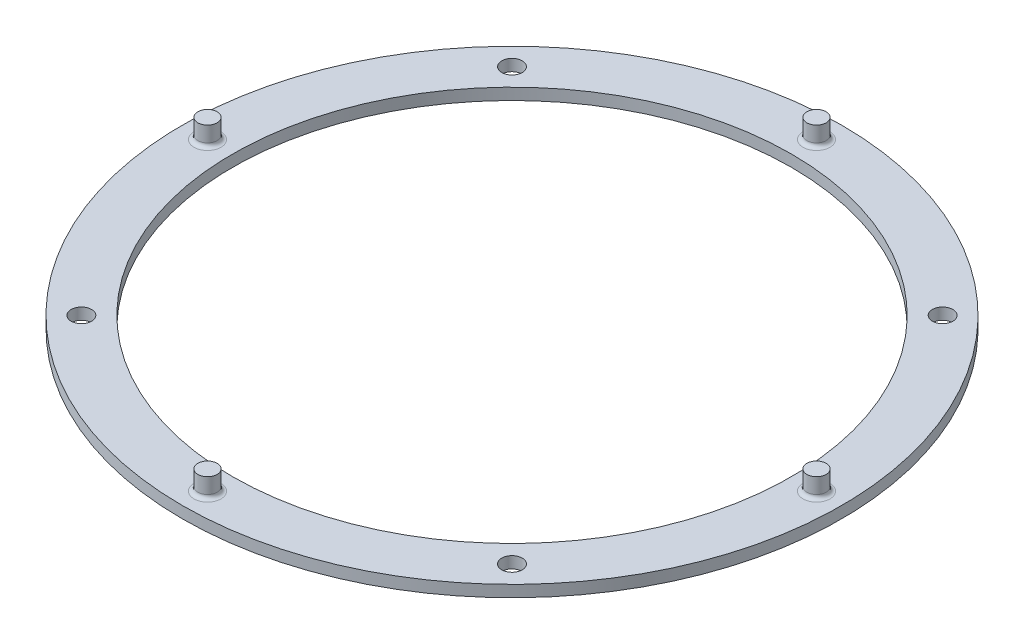
ISO-10303-21;
HEADER;
FILE_DESCRIPTION(('STEP AP214'),'2;1');
FILE_NAME('part.step','',(''),(''),'','','');
FILE_SCHEMA(('AUTOMOTIVE_DESIGN { 1 0 10303 214 1 1 1 1 }'));
ENDSEC;
DATA;
#1=APPLICATION_CONTEXT('core data for automotive mechanical design processes');
#2=APPLICATION_PROTOCOL_DEFINITION('international standard','automotive_design',2000,#1);
#3=PRODUCT_CONTEXT('',#1,'mechanical');
#4=PRODUCT('Part','Part','',(#3));
#5=PRODUCT_RELATED_PRODUCT_CATEGORY('part','',(#4));
#6=PRODUCT_DEFINITION_FORMATION('','',#4);
#7=PRODUCT_DEFINITION_CONTEXT('part definition',#1,'design');
#8=PRODUCT_DEFINITION('design','',#6,#7);
#9=PRODUCT_DEFINITION_SHAPE('','',#8);
#10=(LENGTH_UNIT() NAMED_UNIT(*) SI_UNIT(.MILLI.,.METRE.));
#11=(NAMED_UNIT(*) PLANE_ANGLE_UNIT() SI_UNIT($,.RADIAN.));
#12=(NAMED_UNIT(*) SI_UNIT($,.STERADIAN.) SOLID_ANGLE_UNIT());
#13=UNCERTAINTY_MEASURE_WITH_UNIT(LENGTH_MEASURE(1.E-05),#10,'distance_accuracy_value','');
#14=(GEOMETRIC_REPRESENTATION_CONTEXT(3) GLOBAL_UNCERTAINTY_ASSIGNED_CONTEXT((#13)) GLOBAL_UNIT_ASSIGNED_CONTEXT((#10,
#11,#12)) REPRESENTATION_CONTEXT('',''));
#15=CARTESIAN_POINT('',(0.,0.,0.));
#16=DIRECTION('',(0.,0.,1.));
#17=DIRECTION('',(1.,0.,0.));
#18=AXIS2_PLACEMENT_3D('',#15,#16,#17);
#19=CARTESIAN_POINT('',(0.,3.,0.));
#20=DIRECTION('',(0.,1.,0.));
#21=DIRECTION('',(0.,0.,1.));
#22=AXIS2_PLACEMENT_3D('',#19,#20,#21);
#23=PLANE('',#22);
#24=CARTESIAN_POINT('',(55.8614357137374,3.,-55.8614357137372));
#25=DIRECTION('',(0.,1.,0.));
#26=DIRECTION('',(0.,0.,1.));
#27=AXIS2_PLACEMENT_3D('',#24,#25,#26);
#28=CIRCLE('',#27,2.65);
#29=CARTESIAN_POINT('',(55.8614357137374,3.,-53.2114357137372));
#30=VERTEX_POINT('',#29);
#31=EDGE_CURVE('E249',#30,#30,#28,.T.);
#32=ORIENTED_EDGE('',*,*,#31,.F.);
#33=EDGE_LOOP('',(#32));
#34=FACE_BOUND('',#33,.T.);
#35=CARTESIAN_POINT('',(55.861435713737,3.,55.8614357137375));
#36=DIRECTION('',(0.,1.,0.));
#37=DIRECTION('',(0.,0.,1.));
#38=AXIS2_PLACEMENT_3D('',#35,#36,#37);
#39=CIRCLE('',#38,2.65);
#40=CARTESIAN_POINT('',(55.861435713737,3.,58.5114357137375));
#41=VERTEX_POINT('',#40);
#42=EDGE_CURVE('E242',#41,#41,#39,.T.);
#43=ORIENTED_EDGE('',*,*,#42,.F.);
#44=EDGE_LOOP('',(#43));
#45=FACE_BOUND('',#44,.T.);
#46=CARTESIAN_POINT('',(-55.8614357137377,3.,55.8614357137368));
#47=DIRECTION('',(0.,1.,0.));
#48=DIRECTION('',(0.,0.,1.));
#49=AXIS2_PLACEMENT_3D('',#46,#47,#48);
#50=CIRCLE('',#49,2.64999999999999);
#51=CARTESIAN_POINT('',(-55.8614357137377,3.,58.5114357137368));
#52=VERTEX_POINT('',#51);
#53=EDGE_CURVE('E234',#52,#52,#50,.T.);
#54=ORIENTED_EDGE('',*,*,#53,.F.);
#55=EDGE_LOOP('',(#54));
#56=FACE_BOUND('',#55,.T.);
#57=CARTESIAN_POINT('',(-55.8614357137366,3.,-55.8614357137379));
#58=DIRECTION('',(0.,1.,0.));
#59=DIRECTION('',(0.,0.,1.));
#60=AXIS2_PLACEMENT_3D('',#57,#58,#59);
#61=CIRCLE('',#60,2.65);
#62=CARTESIAN_POINT('',(-55.8614357137366,3.,-53.2114357137379));
#63=VERTEX_POINT('',#62);
#64=EDGE_CURVE('E67',#63,#63,#61,.T.);
#65=ORIENTED_EDGE('',*,*,#64,.F.);
#66=EDGE_LOOP('',(#65));
#67=FACE_BOUND('',#66,.T.);
#68=CARTESIAN_POINT('',(79.,3.,2.75827025768608E-13));
#69=DIRECTION('',(0.,1.,0.));
#70=DIRECTION('',(0.,0.,1.));
#71=AXIS2_PLACEMENT_3D('',#68,#69,#70);
#72=CIRCLE('',#71,3.50000000000001);
#73=CARTESIAN_POINT('',(79.,3.,3.50000000000028));
#74=VERTEX_POINT('',#73);
#75=EDGE_CURVE('E125',#74,#74,#72,.F.);
#76=ORIENTED_EDGE('',*,*,#75,.T.);
#77=EDGE_LOOP('',(#76));
#78=FACE_BOUND('',#77,.T.);
#79=CARTESIAN_POINT('',(0.,3.,-79.));
#80=DIRECTION('',(0.,1.,0.));
#81=DIRECTION('',(0.,0.,1.));
#82=AXIS2_PLACEMENT_3D('',#79,#80,#81);
#83=CIRCLE('',#82,3.5);
#84=CARTESIAN_POINT('',(0.,3.,-75.5));
#85=VERTEX_POINT('',#84);
#86=EDGE_CURVE('E121',#85,#85,#83,.F.);
#87=ORIENTED_EDGE('',*,*,#86,.T.);
#88=EDGE_LOOP('',(#87));
#89=FACE_BOUND('',#88,.T.);
#90=CARTESIAN_POINT('',(-79.,3.,-8.27481077305823E-13));
#91=DIRECTION('',(0.,1.,0.));
#92=DIRECTION('',(0.,0.,1.));
#93=AXIS2_PLACEMENT_3D('',#90,#91,#92);
#94=CIRCLE('',#93,3.5);
#95=CARTESIAN_POINT('',(-79.,3.,3.49999999999917));
#96=VERTEX_POINT('',#95);
#97=EDGE_CURVE('E117',#96,#96,#94,.F.);
#98=ORIENTED_EDGE('',*,*,#97,.T.);
#99=EDGE_LOOP('',(#98));
#100=FACE_BOUND('',#99,.T.);
#101=CARTESIAN_POINT('',(-5.51654051537215E-13,3.,79.));
#102=DIRECTION('',(0.,1.,0.));
#103=DIRECTION('',(0.,0.,1.));
#104=AXIS2_PLACEMENT_3D('',#101,#102,#103);
#105=CIRCLE('',#104,3.5);
#106=CARTESIAN_POINT('',(-5.51654051537215E-13,3.,82.5));
#107=VERTEX_POINT('',#106);
#108=EDGE_CURVE('E113',#107,#107,#105,.F.);
#109=ORIENTED_EDGE('',*,*,#108,.T.);
#110=EDGE_LOOP('',(#109));
#111=FACE_BOUND('',#110,.T.);
#112=CARTESIAN_POINT('',(0.,3.,0.));
#113=DIRECTION('',(0.,1.,0.));
#114=DIRECTION('',(0.,0.,1.));
#115=AXIS2_PLACEMENT_3D('',#112,#113,#114);
#116=CIRCLE('',#115,85.5);
#117=CARTESIAN_POINT('',(0.,3.,85.5));
#118=VERTEX_POINT('',#117);
#119=EDGE_CURVE('E102',#118,#118,#116,.T.);
#120=ORIENTED_EDGE('',*,*,#119,.T.);
#121=EDGE_LOOP('',(#120));
#122=FACE_BOUND('',#121,.T.);
#123=CARTESIAN_POINT('',(0.,3.,0.));
#124=DIRECTION('',(0.,1.,0.));
#125=DIRECTION('',(0.,0.,1.));
#126=AXIS2_PLACEMENT_3D('',#123,#124,#125);
#127=CIRCLE('',#126,72.5);
#128=CARTESIAN_POINT('',(0.,3.,72.5));
#129=VERTEX_POINT('',#128);
#130=EDGE_CURVE('E92',#129,#129,#127,.T.);
#131=ORIENTED_EDGE('',*,*,#130,.F.);
#132=EDGE_LOOP('',(#131));
#133=FACE_BOUND('',#132,.T.);
#134=ADVANCED_FACE('F43',(#34,#45,#56,#67,#78,#89,#100,#111,#122,#133),#23,.T.);
#135=CARTESIAN_POINT('',(0.,0.,0.));
#136=DIRECTION('',(0.,1.,0.));
#137=DIRECTION('',(0.,0.,1.));
#138=AXIS2_PLACEMENT_3D('',#135,#136,#137);
#139=PLANE('',#138);
#140=CARTESIAN_POINT('',(55.8614357137374,0.,-55.8614357137372));
#141=DIRECTION('',(0.,1.,0.));
#142=DIRECTION('',(0.,0.,1.));
#143=AXIS2_PLACEMENT_3D('',#140,#141,#142);
#144=CIRCLE('',#143,2.65);
#145=CARTESIAN_POINT('',(55.8614357137374,0.,-53.2114357137372));
#146=VERTEX_POINT('',#145);
#147=EDGE_CURVE('E47',#146,#146,#144,.T.);
#148=ORIENTED_EDGE('',*,*,#147,.T.);
#149=EDGE_LOOP('',(#148));
#150=FACE_BOUND('',#149,.T.);
#151=CARTESIAN_POINT('',(55.861435713737,0.,55.8614357137375));
#152=DIRECTION('',(0.,1.,0.));
#153=DIRECTION('',(0.,0.,1.));
#154=AXIS2_PLACEMENT_3D('',#151,#152,#153);
#155=CIRCLE('',#154,2.65);
#156=CARTESIAN_POINT('',(55.861435713737,0.,58.5114357137375));
#157=VERTEX_POINT('',#156);
#158=EDGE_CURVE('E70',#157,#157,#155,.T.);
#159=ORIENTED_EDGE('',*,*,#158,.T.);
#160=EDGE_LOOP('',(#159));
#161=FACE_BOUND('',#160,.T.);
#162=CARTESIAN_POINT('',(-55.8614357137377,0.,55.8614357137368));
#163=DIRECTION('',(0.,1.,0.));
#164=DIRECTION('',(0.,0.,1.));
#165=AXIS2_PLACEMENT_3D('',#162,#163,#164);
#166=CIRCLE('',#165,2.64999999999999);
#167=CARTESIAN_POINT('',(-55.8614357137377,0.,58.5114357137368));
#168=VERTEX_POINT('',#167);
#169=EDGE_CURVE('E66',#168,#168,#166,.T.);
#170=ORIENTED_EDGE('',*,*,#169,.T.);
#171=EDGE_LOOP('',(#170));
#172=FACE_BOUND('',#171,.T.);
#173=CARTESIAN_POINT('',(-55.8614357137366,0.,-55.8614357137379));
#174=DIRECTION('',(0.,1.,0.));
#175=DIRECTION('',(0.,0.,1.));
#176=AXIS2_PLACEMENT_3D('',#173,#174,#175);
#177=CIRCLE('',#176,2.65);
#178=CARTESIAN_POINT('',(-55.8614357137366,0.,-53.2114357137379));
#179=VERTEX_POINT('',#178);
#180=EDGE_CURVE('E62',#179,#179,#177,.T.);
#181=ORIENTED_EDGE('',*,*,#180,.T.);
#182=EDGE_LOOP('',(#181));
#183=FACE_BOUND('',#182,.T.);
#184=CARTESIAN_POINT('',(0.,0.,0.));
#185=DIRECTION('',(0.,1.,0.));
#186=DIRECTION('',(0.,0.,1.));
#187=AXIS2_PLACEMENT_3D('',#184,#185,#186);
#188=CIRCLE('',#187,85.5);
#189=CARTESIAN_POINT('',(0.,0.,85.5));
#190=VERTEX_POINT('',#189);
#191=EDGE_CURVE('E96',#190,#190,#188,.T.);
#192=ORIENTED_EDGE('',*,*,#191,.F.);
#193=EDGE_LOOP('',(#192));
#194=FACE_BOUND('',#193,.T.);
#195=CARTESIAN_POINT('',(0.,0.,0.));
#196=DIRECTION('',(0.,1.,0.));
#197=DIRECTION('',(0.,0.,1.));
#198=AXIS2_PLACEMENT_3D('',#195,#196,#197);
#199=CIRCLE('',#198,72.5);
#200=CARTESIAN_POINT('',(0.,0.,72.5));
#201=VERTEX_POINT('',#200);
#202=EDGE_CURVE('E97',#201,#201,#199,.T.);
#203=ORIENTED_EDGE('',*,*,#202,.T.);
#204=EDGE_LOOP('',(#203));
#205=FACE_BOUND('',#204,.T.);
#206=ADVANCED_FACE('F151',(#150,#161,#172,#183,#194,#205),#139,.F.);
#207=CARTESIAN_POINT('',(0.,3.,0.));
#208=DIRECTION('',(0.,-1.,0.));
#209=DIRECTION('',(0.,0.,-1.));
#210=AXIS2_PLACEMENT_3D('',#207,#208,#209);
#211=CYLINDRICAL_SURFACE('',#210,85.5);
#212=ORIENTED_EDGE('',*,*,#119,.F.);
#213=EDGE_LOOP('',(#212));
#214=FACE_BOUND('',#213,.T.);
#215=ORIENTED_EDGE('',*,*,#191,.T.);
#216=EDGE_LOOP('',(#215));
#217=FACE_BOUND('',#216,.T.);
#218=ADVANCED_FACE('F158',(#214,#217),#211,.T.);
#219=CARTESIAN_POINT('',(0.,3.,0.));
#220=DIRECTION('',(0.,-1.,0.));
#221=DIRECTION('',(0.,0.,-1.));
#222=AXIS2_PLACEMENT_3D('',#219,#220,#221);
#223=CYLINDRICAL_SURFACE('',#222,72.5);
#224=ORIENTED_EDGE('',*,*,#130,.T.);
#225=EDGE_LOOP('',(#224));
#226=FACE_BOUND('',#225,.T.);
#227=ORIENTED_EDGE('',*,*,#202,.F.);
#228=EDGE_LOOP('',(#227));
#229=FACE_BOUND('',#228,.T.);
#230=ADVANCED_FACE('F163',(#226,#229),#223,.F.);
#231=CARTESIAN_POINT('',(-5.51654051537215E-13,8.,79.));
#232=DIRECTION('',(0.,-1.,0.));
#233=DIRECTION('',(0.,0.,-1.));
#234=AXIS2_PLACEMENT_3D('',#231,#232,#233);
#235=CYLINDRICAL_SURFACE('',#234,2.5);
#236=CARTESIAN_POINT('',(-5.51654051537215E-13,4.,79.));
#237=DIRECTION('',(0.,1.,0.));
#238=DIRECTION('',(0.,0.,1.));
#239=AXIS2_PLACEMENT_3D('',#236,#237,#238);
#240=CIRCLE('',#239,2.5);
#241=CARTESIAN_POINT('',(-5.51654051537215E-13,4.,81.5));
#242=VERTEX_POINT('',#241);
#243=EDGE_CURVE('E10',#242,#242,#240,.T.);
#244=ORIENTED_EDGE('',*,*,#243,.T.);
#245=EDGE_LOOP('',(#244));
#246=FACE_BOUND('',#245,.T.);
#247=CARTESIAN_POINT('',(-5.51654051537215E-13,8.,79.));
#248=DIRECTION('',(0.,1.,0.));
#249=DIRECTION('',(0.,0.,1.));
#250=AXIS2_PLACEMENT_3D('',#247,#248,#249);
#251=CIRCLE('',#250,2.5);
#252=CARTESIAN_POINT('',(-5.51654051537215E-13,8.,81.5));
#253=VERTEX_POINT('',#252);
#254=EDGE_CURVE('E77',#253,#253,#251,.T.);
#255=ORIENTED_EDGE('',*,*,#254,.F.);
#256=EDGE_LOOP('',(#255));
#257=FACE_BOUND('',#256,.T.);
#258=ADVANCED_FACE('F171',(#246,#257),#235,.T.);
#259=CARTESIAN_POINT('',(-5.51654051537215E-13,8.,79.));
#260=DIRECTION('',(0.,1.,0.));
#261=DIRECTION('',(0.,0.,1.));
#262=AXIS2_PLACEMENT_3D('',#259,#260,#261);
#263=PLANE('',#262);
#264=ORIENTED_EDGE('',*,*,#254,.T.);
#265=EDGE_LOOP('',(#264));
#266=FACE_BOUND('',#265,.T.);
#267=ADVANCED_FACE('F187',(#266),#263,.T.);
#268=CARTESIAN_POINT('',(79.,8.,2.75827025768608E-13));
#269=DIRECTION('',(0.,-1.,0.));
#270=DIRECTION('',(0.,0.,-1.));
#271=AXIS2_PLACEMENT_3D('',#268,#269,#270);
#272=CYLINDRICAL_SURFACE('',#271,2.50000000000001);
#273=CARTESIAN_POINT('',(79.,4.,2.75827025768608E-13));
#274=DIRECTION('',(0.,1.,0.));
#275=DIRECTION('',(0.,0.,1.));
#276=AXIS2_PLACEMENT_3D('',#273,#274,#275);
#277=CIRCLE('',#276,2.50000000000001);
#278=CARTESIAN_POINT('',(79.,4.,2.50000000000028));
#279=VERTEX_POINT('',#278);
#280=EDGE_CURVE('E106',#279,#279,#277,.T.);
#281=ORIENTED_EDGE('',*,*,#280,.T.);
#282=EDGE_LOOP('',(#281));
#283=FACE_BOUND('',#282,.T.);
#284=CARTESIAN_POINT('',(79.,8.,2.75827025768608E-13));
#285=DIRECTION('',(0.,1.,0.));
#286=DIRECTION('',(0.,0.,1.));
#287=AXIS2_PLACEMENT_3D('',#284,#285,#286);
#288=CIRCLE('',#287,2.50000000000001);
#289=CARTESIAN_POINT('',(79.,8.,2.50000000000028));
#290=VERTEX_POINT('',#289);
#291=EDGE_CURVE('E82',#290,#290,#288,.T.);
#292=ORIENTED_EDGE('',*,*,#291,.F.);
#293=EDGE_LOOP('',(#292));
#294=FACE_BOUND('',#293,.T.);
#295=ADVANCED_FACE('F193',(#283,#294),#272,.T.);
#296=CARTESIAN_POINT('',(79.,8.,2.75827025768608E-13));
#297=DIRECTION('',(0.,1.,0.));
#298=DIRECTION('',(0.,0.,1.));
#299=AXIS2_PLACEMENT_3D('',#296,#297,#298);
#300=PLANE('',#299);
#301=ORIENTED_EDGE('',*,*,#291,.T.);
#302=EDGE_LOOP('',(#301));
#303=FACE_BOUND('',#302,.T.);
#304=ADVANCED_FACE('F196',(#303),#300,.T.);
#305=CARTESIAN_POINT('',(-79.,8.,-8.27481077305823E-13));
#306=DIRECTION('',(0.,-1.,0.));
#307=DIRECTION('',(0.,0.,-1.));
#308=AXIS2_PLACEMENT_3D('',#305,#306,#307);
#309=CYLINDRICAL_SURFACE('',#308,2.5);
#310=CARTESIAN_POINT('',(-79.,4.,-8.27481077305823E-13));
#311=DIRECTION('',(0.,1.,0.));
#312=DIRECTION('',(0.,0.,1.));
#313=AXIS2_PLACEMENT_3D('',#310,#311,#312);
#314=CIRCLE('',#313,2.5);
#315=CARTESIAN_POINT('',(-79.,4.,2.49999999999917));
#316=VERTEX_POINT('',#315);
#317=EDGE_CURVE('E52',#316,#316,#314,.T.);
#318=ORIENTED_EDGE('',*,*,#317,.T.);
#319=EDGE_LOOP('',(#318));
#320=FACE_BOUND('',#319,.T.);
#321=CARTESIAN_POINT('',(-79.,8.,-8.27481077305823E-13));
#322=DIRECTION('',(0.,1.,0.));
#323=DIRECTION('',(0.,0.,1.));
#324=AXIS2_PLACEMENT_3D('',#321,#322,#323);
#325=CIRCLE('',#324,2.5);
#326=CARTESIAN_POINT('',(-79.,8.,2.49999999999917));
#327=VERTEX_POINT('',#326);
#328=EDGE_CURVE('E88',#327,#327,#325,.T.);
#329=ORIENTED_EDGE('',*,*,#328,.F.);
#330=EDGE_LOOP('',(#329));
#331=FACE_BOUND('',#330,.T.);
#332=ADVANCED_FACE('F199',(#320,#331),#309,.T.);
#333=CARTESIAN_POINT('',(-79.,8.,-8.27481077305823E-13));
#334=DIRECTION('',(0.,1.,0.));
#335=DIRECTION('',(0.,0.,1.));
#336=AXIS2_PLACEMENT_3D('',#333,#334,#335);
#337=PLANE('',#336);
#338=ORIENTED_EDGE('',*,*,#328,.T.);
#339=EDGE_LOOP('',(#338));
#340=FACE_BOUND('',#339,.T.);
#341=ADVANCED_FACE('F203',(#340),#337,.T.);
#342=CARTESIAN_POINT('',(0.,8.,-79.));
#343=DIRECTION('',(0.,-1.,0.));
#344=DIRECTION('',(0.,0.,-1.));
#345=AXIS2_PLACEMENT_3D('',#342,#343,#344);
#346=CYLINDRICAL_SURFACE('',#345,2.5);
#347=CARTESIAN_POINT('',(0.,4.,-79.));
#348=DIRECTION('',(0.,1.,0.));
#349=DIRECTION('',(0.,0.,1.));
#350=AXIS2_PLACEMENT_3D('',#347,#348,#349);
#351=CIRCLE('',#350,2.5);
#352=CARTESIAN_POINT('',(0.,4.,-76.5));
#353=VERTEX_POINT('',#352);
#354=EDGE_CURVE('E58',#353,#353,#351,.T.);
#355=ORIENTED_EDGE('',*,*,#354,.T.);
#356=EDGE_LOOP('',(#355));
#357=FACE_BOUND('',#356,.T.);
#358=CARTESIAN_POINT('',(0.,8.,-79.));
#359=DIRECTION('',(0.,1.,0.));
#360=DIRECTION('',(0.,0.,1.));
#361=AXIS2_PLACEMENT_3D('',#358,#359,#360);
#362=CIRCLE('',#361,2.5);
#363=CARTESIAN_POINT('',(0.,8.,-76.5));
#364=VERTEX_POINT('',#363);
#365=EDGE_CURVE('E101',#364,#364,#362,.T.);
#366=ORIENTED_EDGE('',*,*,#365,.F.);
#367=EDGE_LOOP('',(#366));
#368=FACE_BOUND('',#367,.T.);
#369=ADVANCED_FACE('F132',(#357,#368),#346,.T.);
#370=CARTESIAN_POINT('',(0.,8.,-79.));
#371=DIRECTION('',(0.,1.,0.));
#372=DIRECTION('',(0.,0.,1.));
#373=AXIS2_PLACEMENT_3D('',#370,#371,#372);
#374=PLANE('',#373);
#375=ORIENTED_EDGE('',*,*,#365,.T.);
#376=EDGE_LOOP('',(#375));
#377=FACE_BOUND('',#376,.T.);
#378=ADVANCED_FACE('F146',(#377),#374,.T.);
#379=CARTESIAN_POINT('',(79.,4.,2.75827025768608E-13));
#380=DIRECTION('',(0.,1.,0.));
#381=DIRECTION('',(0.,0.,1.));
#382=AXIS2_PLACEMENT_3D('',#379,#380,#381);
#383=TOROIDAL_SURFACE('',#382,3.50000000000001,1.);
#384=ORIENTED_EDGE('',*,*,#75,.F.);
#385=EDGE_LOOP('',(#384));
#386=FACE_BOUND('',#385,.T.);
#387=ORIENTED_EDGE('',*,*,#280,.F.);
#388=EDGE_LOOP('',(#387));
#389=FACE_BOUND('',#388,.T.);
#390=ADVANCED_FACE('F138',(#386,#389),#383,.F.);
#391=CARTESIAN_POINT('',(0.,4.,-79.));
#392=DIRECTION('',(0.,1.,0.));
#393=DIRECTION('',(0.,0.,1.));
#394=AXIS2_PLACEMENT_3D('',#391,#392,#393);
#395=TOROIDAL_SURFACE('',#394,3.5,1.);
#396=ORIENTED_EDGE('',*,*,#86,.F.);
#397=EDGE_LOOP('',(#396));
#398=FACE_BOUND('',#397,.T.);
#399=ORIENTED_EDGE('',*,*,#354,.F.);
#400=EDGE_LOOP('',(#399));
#401=FACE_BOUND('',#400,.T.);
#402=ADVANCED_FACE('F135',(#398,#401),#395,.F.);
#403=CARTESIAN_POINT('',(-79.,4.,-8.27481077305823E-13));
#404=DIRECTION('',(0.,1.,0.));
#405=DIRECTION('',(0.,0.,1.));
#406=AXIS2_PLACEMENT_3D('',#403,#404,#405);
#407=TOROIDAL_SURFACE('',#406,3.5,1.);
#408=ORIENTED_EDGE('',*,*,#97,.F.);
#409=EDGE_LOOP('',(#408));
#410=FACE_BOUND('',#409,.T.);
#411=ORIENTED_EDGE('',*,*,#317,.F.);
#412=EDGE_LOOP('',(#411));
#413=FACE_BOUND('',#412,.T.);
#414=ADVANCED_FACE('F137',(#410,#413),#407,.F.);
#415=CARTESIAN_POINT('',(-5.51654051537215E-13,4.,79.));
#416=DIRECTION('',(0.,1.,0.));
#417=DIRECTION('',(0.,0.,1.));
#418=AXIS2_PLACEMENT_3D('',#415,#416,#417);
#419=TOROIDAL_SURFACE('',#418,3.5,1.);
#420=ORIENTED_EDGE('',*,*,#108,.F.);
#421=EDGE_LOOP('',(#420));
#422=FACE_BOUND('',#421,.T.);
#423=ORIENTED_EDGE('',*,*,#243,.F.);
#424=EDGE_LOOP('',(#423));
#425=FACE_BOUND('',#424,.T.);
#426=ADVANCED_FACE('F45',(#422,#425),#419,.F.);
#427=CARTESIAN_POINT('',(-55.8614357137366,-2.,-55.8614357137379));
#428=DIRECTION('',(0.,1.,0.));
#429=DIRECTION('',(0.,0.,1.));
#430=AXIS2_PLACEMENT_3D('',#427,#428,#429);
#431=CYLINDRICAL_SURFACE('',#430,2.65);
#432=ORIENTED_EDGE('',*,*,#64,.T.);
#433=EDGE_LOOP('',(#432));
#434=FACE_BOUND('',#433,.T.);
#435=ORIENTED_EDGE('',*,*,#180,.F.);
#436=EDGE_LOOP('',(#435));
#437=FACE_BOUND('',#436,.T.);
#438=ADVANCED_FACE('F214',(#434,#437),#431,.F.);
#439=CARTESIAN_POINT('',(-55.8614357137377,-2.,55.8614357137368));
#440=DIRECTION('',(0.,1.,0.));
#441=DIRECTION('',(0.,0.,1.));
#442=AXIS2_PLACEMENT_3D('',#439,#440,#441);
#443=CYLINDRICAL_SURFACE('',#442,2.64999999999999);
#444=ORIENTED_EDGE('',*,*,#53,.T.);
#445=EDGE_LOOP('',(#444));
#446=FACE_BOUND('',#445,.T.);
#447=ORIENTED_EDGE('',*,*,#169,.F.);
#448=EDGE_LOOP('',(#447));
#449=FACE_BOUND('',#448,.T.);
#450=ADVANCED_FACE('F217',(#446,#449),#443,.F.);
#451=CARTESIAN_POINT('',(55.861435713737,-2.,55.8614357137375));
#452=DIRECTION('',(0.,1.,0.));
#453=DIRECTION('',(0.,0.,1.));
#454=AXIS2_PLACEMENT_3D('',#451,#452,#453);
#455=CYLINDRICAL_SURFACE('',#454,2.65);
#456=ORIENTED_EDGE('',*,*,#42,.T.);
#457=EDGE_LOOP('',(#456));
#458=FACE_BOUND('',#457,.T.);
#459=ORIENTED_EDGE('',*,*,#158,.F.);
#460=EDGE_LOOP('',(#459));
#461=FACE_BOUND('',#460,.T.);
#462=ADVANCED_FACE('F222',(#458,#461),#455,.F.);
#463=CARTESIAN_POINT('',(55.8614357137374,-2.,-55.8614357137372));
#464=DIRECTION('',(0.,1.,0.));
#465=DIRECTION('',(0.,0.,1.));
#466=AXIS2_PLACEMENT_3D('',#463,#464,#465);
#467=CYLINDRICAL_SURFACE('',#466,2.65);
#468=ORIENTED_EDGE('',*,*,#31,.T.);
#469=EDGE_LOOP('',(#468));
#470=FACE_BOUND('',#469,.T.);
#471=ORIENTED_EDGE('',*,*,#147,.F.);
#472=EDGE_LOOP('',(#471));
#473=FACE_BOUND('',#472,.T.);
#474=ADVANCED_FACE('F219',(#470,#473),#467,.F.);
#475=CLOSED_SHELL('',(#134,#206,#218,#230,#258,#267,#295,#304,#332,#341,#369,#378,#390,#402,
#414,#426,#438,#450,#462,#474));
#476=MANIFOLD_SOLID_BREP('B2',#475);
#477=ADVANCED_BREP_SHAPE_REPRESENTATION('',(#18,#476),#14);
#478=SHAPE_DEFINITION_REPRESENTATION(#9,#477);
ENDSEC;
END-ISO-10303-21;
